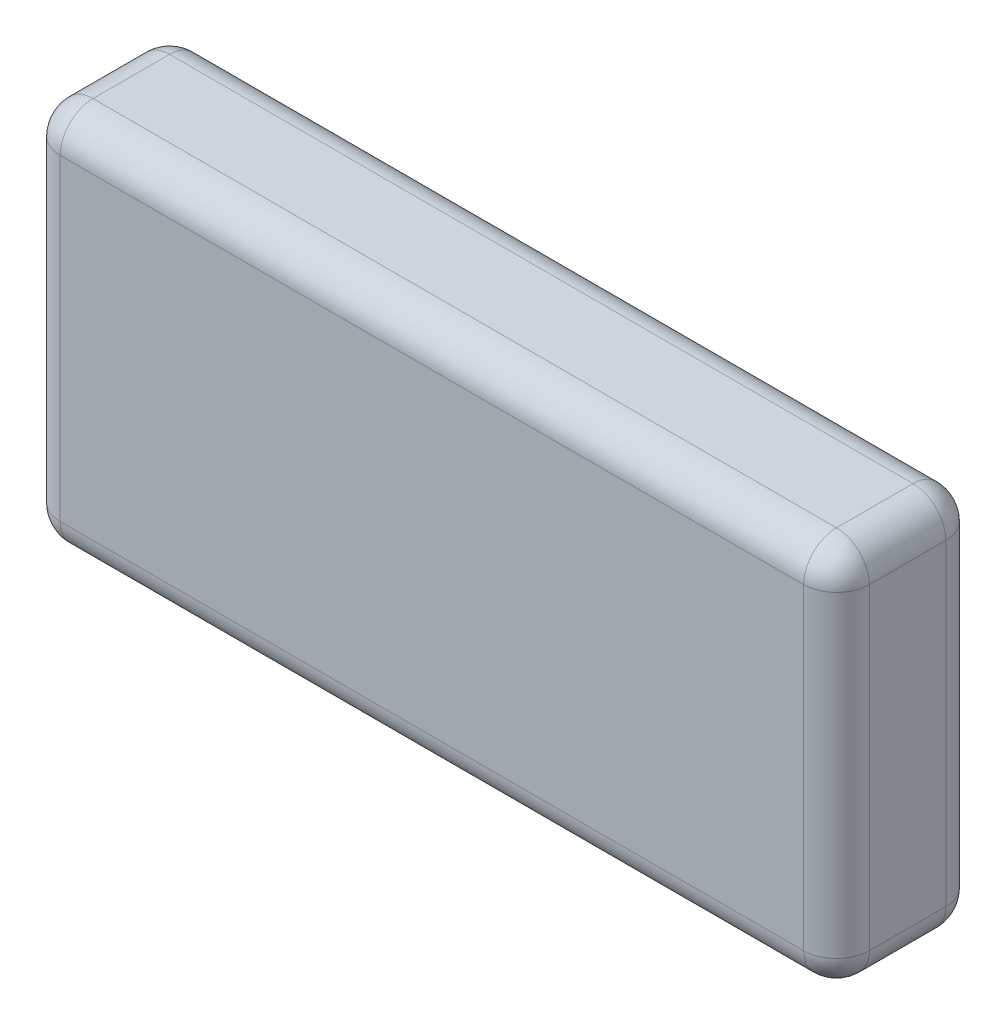
ISO-10303-21;
HEADER;
FILE_DESCRIPTION(('STEP AP214'),'2;1');
FILE_NAME('part.step','',(''),(''),'','','');
FILE_SCHEMA(('AUTOMOTIVE_DESIGN { 1 0 10303 214 1 1 1 1 }'));
ENDSEC;
DATA;
#1=APPLICATION_CONTEXT('core data for automotive mechanical design processes');
#2=APPLICATION_PROTOCOL_DEFINITION('international standard','automotive_design',2000,#1);
#3=PRODUCT_CONTEXT('',#1,'mechanical');
#4=PRODUCT('Part','Part','',(#3));
#5=PRODUCT_RELATED_PRODUCT_CATEGORY('part','',(#4));
#6=PRODUCT_DEFINITION_FORMATION('','',#4);
#7=PRODUCT_DEFINITION_CONTEXT('part definition',#1,'design');
#8=PRODUCT_DEFINITION('design','',#6,#7);
#9=PRODUCT_DEFINITION_SHAPE('','',#8);
#10=(LENGTH_UNIT() NAMED_UNIT(*) SI_UNIT(.MILLI.,.METRE.));
#11=(NAMED_UNIT(*) PLANE_ANGLE_UNIT() SI_UNIT($,.RADIAN.));
#12=(NAMED_UNIT(*) SI_UNIT($,.STERADIAN.) SOLID_ANGLE_UNIT());
#13=UNCERTAINTY_MEASURE_WITH_UNIT(LENGTH_MEASURE(1.E-05),#10,'distance_accuracy_value','');
#14=(GEOMETRIC_REPRESENTATION_CONTEXT(3) GLOBAL_UNCERTAINTY_ASSIGNED_CONTEXT((#13)) GLOBAL_UNIT_ASSIGNED_CONTEXT((#10,
#11,#12)) REPRESENTATION_CONTEXT('',''));
#15=CARTESIAN_POINT('',(0.,0.,0.));
#16=DIRECTION('',(0.,0.,1.));
#17=DIRECTION('',(1.,0.,0.));
#18=AXIS2_PLACEMENT_3D('',#15,#16,#17);
#19=CARTESIAN_POINT('',(-27.1121918241811,25.9843027227722,13.));
#20=DIRECTION('',(1.,0.,0.));
#21=DIRECTION('',(0.,1.,0.));
#22=AXIS2_PLACEMENT_3D('',#19,#20,#21);
#23=PLANE('',#22);
#24=DIRECTION('',(0.,-1.,0.));
#25=VECTOR('',#24,1.);
#26=CARTESIAN_POINT('',(-27.1121918241811,25.9843027227722,10.));
#27=LINE('',#26,#25);
#28=CARTESIAN_POINT('',(-27.1121918241811,-6.01569727722784,10.));
#29=VERTEX_POINT('',#28);
#30=CARTESIAN_POINT('',(-27.1121918241811,22.9843027227722,10.));
#31=VERTEX_POINT('',#30);
#32=EDGE_CURVE('E133',#29,#31,#27,.F.);
#33=ORIENTED_EDGE('',*,*,#32,.T.);
#34=DIRECTION('',(0.,0.,-1.));
#35=VECTOR('',#34,1.);
#36=CARTESIAN_POINT('',(-27.1121918241811,22.9843027227722,13.));
#37=LINE('',#36,#35);
#38=CARTESIAN_POINT('',(-27.1121918241811,22.9843027227722,3.));
#39=VERTEX_POINT('',#38);
#40=EDGE_CURVE('E129',#31,#39,#37,.T.);
#41=ORIENTED_EDGE('',*,*,#40,.T.);
#42=DIRECTION('',(0.,-1.,0.));
#43=VECTOR('',#42,1.);
#44=CARTESIAN_POINT('',(-27.1121918241811,25.9843027227722,3.));
#45=LINE('',#44,#43);
#46=CARTESIAN_POINT('',(-27.1121918241811,-6.01569727722784,3.));
#47=VERTEX_POINT('',#46);
#48=EDGE_CURVE('E124',#39,#47,#45,.T.);
#49=ORIENTED_EDGE('',*,*,#48,.T.);
#50=DIRECTION('',(0.,0.,-1.));
#51=VECTOR('',#50,1.);
#52=CARTESIAN_POINT('',(-27.1121918241811,-6.01569727722783,13.));
#53=LINE('',#52,#51);
#54=EDGE_CURVE('E126',#47,#29,#53,.F.);
#55=ORIENTED_EDGE('',*,*,#54,.T.);
#56=EDGE_LOOP('',(#33,#41,#49,#55));
#57=FACE_BOUND('',#56,.T.);
#58=ADVANCED_FACE('F33',(#57),#23,.F.);
#59=CARTESIAN_POINT('',(-27.1121918241811,-9.01569727722784,13.));
#60=DIRECTION('',(0.,1.,0.));
#61=DIRECTION('',(0.,0.,1.));
#62=AXIS2_PLACEMENT_3D('',#59,#60,#61);
#63=PLANE('',#62);
#64=DIRECTION('',(1.,0.,0.));
#65=VECTOR('',#64,1.);
#66=CARTESIAN_POINT('',(-27.1121918241811,-9.01569727722784,3.));
#67=LINE('',#66,#65);
#68=CARTESIAN_POINT('',(-24.1121918241811,-9.01569727722784,3.));
#69=VERTEX_POINT('',#68);
#70=CARTESIAN_POINT('',(43.8878081758189,-9.01569727722784,3.));
#71=VERTEX_POINT('',#70);
#72=EDGE_CURVE('E42',#69,#71,#67,.T.);
#73=ORIENTED_EDGE('',*,*,#72,.T.);
#74=DIRECTION('',(0.,0.,-1.));
#75=VECTOR('',#74,1.);
#76=CARTESIAN_POINT('',(43.8878081758189,-9.01569727722784,13.));
#77=LINE('',#76,#75);
#78=CARTESIAN_POINT('',(43.8878081758189,-9.01569727722784,10.));
#79=VERTEX_POINT('',#78);
#80=EDGE_CURVE('E11',#71,#79,#77,.F.);
#81=ORIENTED_EDGE('',*,*,#80,.T.);
#82=DIRECTION('',(1.,0.,0.));
#83=VECTOR('',#82,1.);
#84=CARTESIAN_POINT('',(-27.1121918241811,-9.01569727722784,10.));
#85=LINE('',#84,#83);
#86=CARTESIAN_POINT('',(-24.1121918241811,-9.01569727722784,10.));
#87=VERTEX_POINT('',#86);
#88=EDGE_CURVE('E56',#79,#87,#85,.F.);
#89=ORIENTED_EDGE('',*,*,#88,.T.);
#90=DIRECTION('',(0.,0.,-1.));
#91=VECTOR('',#90,1.);
#92=CARTESIAN_POINT('',(-24.1121918241811,-9.01569727722784,13.));
#93=LINE('',#92,#91);
#94=EDGE_CURVE('E233',#87,#69,#93,.T.);
#95=ORIENTED_EDGE('',*,*,#94,.T.);
#96=EDGE_LOOP('',(#73,#81,#89,#95));
#97=FACE_BOUND('',#96,.T.);
#98=ADVANCED_FACE('F297',(#97),#63,.F.);
#99=CARTESIAN_POINT('',(46.8878081758189,25.9843027227722,13.));
#100=DIRECTION('',(-1.,0.,0.));
#101=DIRECTION('',(0.,-1.,0.));
#102=AXIS2_PLACEMENT_3D('',#99,#100,#101);
#103=PLANE('',#102);
#104=DIRECTION('',(0.,1.,0.));
#105=VECTOR('',#104,1.);
#106=CARTESIAN_POINT('',(46.8878081758189,25.9843027227722,3.));
#107=LINE('',#106,#105);
#108=CARTESIAN_POINT('',(46.8878081758189,-6.01569727722783,3.));
#109=VERTEX_POINT('',#108);
#110=CARTESIAN_POINT('',(46.8878081758189,22.9843027227722,3.));
#111=VERTEX_POINT('',#110);
#112=EDGE_CURVE('E229',#109,#111,#107,.T.);
#113=ORIENTED_EDGE('',*,*,#112,.T.);
#114=DIRECTION('',(0.,0.,-1.));
#115=VECTOR('',#114,1.);
#116=CARTESIAN_POINT('',(46.8878081758189,22.9843027227722,13.));
#117=LINE('',#116,#115);
#118=CARTESIAN_POINT('',(46.8878081758189,22.9843027227722,10.));
#119=VERTEX_POINT('',#118);
#120=EDGE_CURVE('E231',#111,#119,#117,.F.);
#121=ORIENTED_EDGE('',*,*,#120,.T.);
#122=DIRECTION('',(0.,1.,0.));
#123=VECTOR('',#122,1.);
#124=CARTESIAN_POINT('',(46.8878081758189,-9.01569727722784,10.));
#125=LINE('',#124,#123);
#126=CARTESIAN_POINT('',(46.8878081758189,-6.01569727722783,10.));
#127=VERTEX_POINT('',#126);
#128=EDGE_CURVE('E212',#119,#127,#125,.F.);
#129=ORIENTED_EDGE('',*,*,#128,.T.);
#130=DIRECTION('',(0.,0.,-1.));
#131=VECTOR('',#130,1.);
#132=CARTESIAN_POINT('',(46.8878081758189,-6.01569727722783,13.));
#133=LINE('',#132,#131);
#134=EDGE_CURVE('E221',#127,#109,#133,.T.);
#135=ORIENTED_EDGE('',*,*,#134,.T.);
#136=EDGE_LOOP('',(#113,#121,#129,#135));
#137=FACE_BOUND('',#136,.T.);
#138=ADVANCED_FACE('F302',(#137),#103,.F.);
#139=CARTESIAN_POINT('',(-27.1121918241811,25.9843027227722,13.));
#140=DIRECTION('',(0.,-1.,0.));
#141=DIRECTION('',(0.,0.,-1.));
#142=AXIS2_PLACEMENT_3D('',#139,#140,#141);
#143=PLANE('',#142);
#144=DIRECTION('',(-1.,0.,0.));
#145=VECTOR('',#144,1.);
#146=CARTESIAN_POINT('',(-27.1121918241811,25.9843027227722,3.));
#147=LINE('',#146,#145);
#148=CARTESIAN_POINT('',(43.8878081758189,25.9843027227722,3.));
#149=VERTEX_POINT('',#148);
#150=CARTESIAN_POINT('',(-24.1121918241811,25.9843027227722,3.));
#151=VERTEX_POINT('',#150);
#152=EDGE_CURVE('E263',#149,#151,#147,.T.);
#153=ORIENTED_EDGE('',*,*,#152,.T.);
#154=DIRECTION('',(0.,0.,-1.));
#155=VECTOR('',#154,1.);
#156=CARTESIAN_POINT('',(-24.1121918241811,25.9843027227722,13.));
#157=LINE('',#156,#155);
#158=CARTESIAN_POINT('',(-24.1121918241811,25.9843027227722,10.));
#159=VERTEX_POINT('',#158);
#160=EDGE_CURVE('E267',#151,#159,#157,.F.);
#161=ORIENTED_EDGE('',*,*,#160,.T.);
#162=DIRECTION('',(-1.,0.,0.));
#163=VECTOR('',#162,1.);
#164=CARTESIAN_POINT('',(46.8878081758189,25.9843027227722,10.));
#165=LINE('',#164,#163);
#166=CARTESIAN_POINT('',(43.8878081758189,25.9843027227722,10.));
#167=VERTEX_POINT('',#166);
#168=EDGE_CURVE('E258',#159,#167,#165,.F.);
#169=ORIENTED_EDGE('',*,*,#168,.T.);
#170=DIRECTION('',(0.,0.,-1.));
#171=VECTOR('',#170,1.);
#172=CARTESIAN_POINT('',(43.8878081758189,25.9843027227722,13.));
#173=LINE('',#172,#171);
#174=EDGE_CURVE('E264',#167,#149,#173,.T.);
#175=ORIENTED_EDGE('',*,*,#174,.T.);
#176=EDGE_LOOP('',(#153,#161,#169,#175));
#177=FACE_BOUND('',#176,.T.);
#178=ADVANCED_FACE('F268',(#177),#143,.F.);
#179=CARTESIAN_POINT('',(0.,0.,13.));
#180=DIRECTION('',(0.,0.,1.));
#181=DIRECTION('',(1.,0.,0.));
#182=AXIS2_PLACEMENT_3D('',#179,#180,#181);
#183=PLANE('',#182);
#184=DIRECTION('',(0.,1.,0.));
#185=VECTOR('',#184,1.);
#186=CARTESIAN_POINT('',(43.8878081758189,25.9843027227722,13.));
#187=LINE('',#186,#185);
#188=CARTESIAN_POINT('',(43.8878081758189,-6.01569727722784,13.));
#189=VERTEX_POINT('',#188);
#190=CARTESIAN_POINT('',(43.8878081758189,22.9843027227722,13.));
#191=VERTEX_POINT('',#190);
#192=EDGE_CURVE('E214',#189,#191,#187,.T.);
#193=ORIENTED_EDGE('',*,*,#192,.T.);
#194=DIRECTION('',(-1.,0.,0.));
#195=VECTOR('',#194,1.);
#196=CARTESIAN_POINT('',(-27.1121918241811,22.9843027227722,13.));
#197=LINE('',#196,#195);
#198=CARTESIAN_POINT('',(-24.1121918241811,22.9843027227722,13.));
#199=VERTEX_POINT('',#198);
#200=EDGE_CURVE('E218',#191,#199,#197,.T.);
#201=ORIENTED_EDGE('',*,*,#200,.T.);
#202=DIRECTION('',(0.,-1.,0.));
#203=VECTOR('',#202,1.);
#204=CARTESIAN_POINT('',(-24.1121918241811,-9.01569727722784,13.));
#205=LINE('',#204,#203);
#206=CARTESIAN_POINT('',(-24.1121918241811,-6.01569727722784,13.));
#207=VERTEX_POINT('',#206);
#208=EDGE_CURVE('E219',#199,#207,#205,.T.);
#209=ORIENTED_EDGE('',*,*,#208,.T.);
#210=DIRECTION('',(1.,0.,0.));
#211=VECTOR('',#210,1.);
#212=CARTESIAN_POINT('',(46.8878081758189,-6.01569727722784,13.));
#213=LINE('',#212,#211);
#214=EDGE_CURVE('E223',#207,#189,#213,.T.);
#215=ORIENTED_EDGE('',*,*,#214,.T.);
#216=EDGE_LOOP('',(#193,#201,#209,#215));
#217=FACE_BOUND('',#216,.T.);
#218=ADVANCED_FACE('F284',(#217),#183,.T.);
#219=CARTESIAN_POINT('',(0.,0.,0.));
#220=DIRECTION('',(0.,0.,1.));
#221=DIRECTION('',(1.,0.,0.));
#222=AXIS2_PLACEMENT_3D('',#219,#220,#221);
#223=PLANE('',#222);
#224=DIRECTION('',(0.,-1.,0.));
#225=VECTOR('',#224,1.);
#226=CARTESIAN_POINT('',(-24.1121918241811,0.,0.));
#227=LINE('',#226,#225);
#228=CARTESIAN_POINT('',(-24.1121918241811,-6.01569727722784,0.));
#229=VERTEX_POINT('',#228);
#230=CARTESIAN_POINT('',(-24.1121918241811,22.9843027227722,0.));
#231=VERTEX_POINT('',#230);
#232=EDGE_CURVE('E155',#229,#231,#227,.F.);
#233=ORIENTED_EDGE('',*,*,#232,.T.);
#234=DIRECTION('',(-1.,0.,0.));
#235=VECTOR('',#234,1.);
#236=CARTESIAN_POINT('',(0.,22.9843027227722,0.));
#237=LINE('',#236,#235);
#238=CARTESIAN_POINT('',(43.8878081758189,22.9843027227722,0.));
#239=VERTEX_POINT('',#238);
#240=EDGE_CURVE('E281',#231,#239,#237,.F.);
#241=ORIENTED_EDGE('',*,*,#240,.T.);
#242=DIRECTION('',(0.,1.,0.));
#243=VECTOR('',#242,1.);
#244=CARTESIAN_POINT('',(43.8878081758189,0.,0.));
#245=LINE('',#244,#243);
#246=CARTESIAN_POINT('',(43.8878081758189,-6.01569727722784,0.));
#247=VERTEX_POINT('',#246);
#248=EDGE_CURVE('E279',#239,#247,#245,.F.);
#249=ORIENTED_EDGE('',*,*,#248,.T.);
#250=DIRECTION('',(1.,0.,0.));
#251=VECTOR('',#250,1.);
#252=CARTESIAN_POINT('',(0.,-6.01569727722784,0.));
#253=LINE('',#252,#251);
#254=EDGE_CURVE('E273',#247,#229,#253,.F.);
#255=ORIENTED_EDGE('',*,*,#254,.T.);
#256=EDGE_LOOP('',(#233,#241,#249,#255));
#257=FACE_BOUND('',#256,.T.);
#258=ADVANCED_FACE('F368',(#257),#223,.F.);
#259=CARTESIAN_POINT('',(43.8878081758189,-6.01569727722783,13.));
#260=DIRECTION('',(0.,0.,-1.));
#261=DIRECTION('',(-1.,0.,0.));
#262=AXIS2_PLACEMENT_3D('',#259,#260,#261);
#263=CYLINDRICAL_SURFACE('',#262,3.);
#264=CARTESIAN_POINT('',(43.8878081758189,-6.01569727722784,10.));
#265=DIRECTION('',(0.,0.,1.));
#266=DIRECTION('',(1.,0.,0.));
#267=AXIS2_PLACEMENT_3D('',#264,#265,#266);
#268=CIRCLE('',#267,3.);
#269=EDGE_CURVE('E37',#79,#127,#268,.T.);
#270=ORIENTED_EDGE('',*,*,#269,.F.);
#271=ORIENTED_EDGE('',*,*,#80,.F.);
#272=CARTESIAN_POINT('',(43.8878081758189,-6.01569727722783,3.));
#273=DIRECTION('',(0.,0.,-1.));
#274=DIRECTION('',(-1.,0.,0.));
#275=AXIS2_PLACEMENT_3D('',#272,#273,#274);
#276=CIRCLE('',#275,3.);
#277=EDGE_CURVE('E194',#109,#71,#276,.T.);
#278=ORIENTED_EDGE('',*,*,#277,.F.);
#279=ORIENTED_EDGE('',*,*,#134,.F.);
#280=EDGE_LOOP('',(#270,#271,#278,#279));
#281=FACE_BOUND('',#280,.T.);
#282=ADVANCED_FACE('F35',(#281),#263,.T.);
#283=CARTESIAN_POINT('',(43.8878081758189,-6.01569727722784,10.));
#284=DIRECTION('',(0.,0.,1.));
#285=DIRECTION('',(1.,0.,0.));
#286=AXIS2_PLACEMENT_3D('',#283,#284,#285);
#287=SPHERICAL_SURFACE('',#286,3.);
#288=CARTESIAN_POINT('',(43.8878081758189,-6.01569727722784,10.));
#289=DIRECTION('',(1.,0.,0.));
#290=DIRECTION('',(0.,0.,-1.));
#291=AXIS2_PLACEMENT_3D('',#288,#289,#290);
#292=CIRCLE('',#291,3.);
#293=EDGE_CURVE('E190',#79,#189,#292,.F.);
#294=ORIENTED_EDGE('',*,*,#293,.F.);
#295=ORIENTED_EDGE('',*,*,#269,.T.);
#296=CARTESIAN_POINT('',(43.8878081758189,-6.01569727722783,10.));
#297=DIRECTION('',(0.,-1.,0.));
#298=DIRECTION('',(0.,0.,-1.));
#299=AXIS2_PLACEMENT_3D('',#296,#297,#298);
#300=CIRCLE('',#299,3.);
#301=EDGE_CURVE('E192',#189,#127,#300,.F.);
#302=ORIENTED_EDGE('',*,*,#301,.F.);
#303=EDGE_LOOP('',(#294,#295,#302));
#304=FACE_BOUND('',#303,.T.);
#305=ADVANCED_FACE('F204',(#304),#287,.T.);
#306=CARTESIAN_POINT('',(43.8878081758189,-6.01569727722784,3.));
#307=DIRECTION('',(0.,0.,1.));
#308=DIRECTION('',(1.,0.,0.));
#309=AXIS2_PLACEMENT_3D('',#306,#307,#308);
#310=SPHERICAL_SURFACE('',#309,3.);
#311=CARTESIAN_POINT('',(43.8878081758189,-6.01569727722784,3.));
#312=DIRECTION('',(0.,-1.,0.));
#313=DIRECTION('',(1.,0.,0.));
#314=AXIS2_PLACEMENT_3D('',#311,#312,#313);
#315=CIRCLE('',#314,3.);
#316=EDGE_CURVE('E184',#109,#247,#315,.F.);
#317=ORIENTED_EDGE('',*,*,#316,.F.);
#318=ORIENTED_EDGE('',*,*,#277,.T.);
#319=CARTESIAN_POINT('',(43.8878081758189,-6.01569727722784,3.));
#320=DIRECTION('',(1.,0.,0.));
#321=DIRECTION('',(0.,0.,-1.));
#322=AXIS2_PLACEMENT_3D('',#319,#320,#321);
#323=CIRCLE('',#322,3.);
#324=EDGE_CURVE('E187',#247,#71,#323,.F.);
#325=ORIENTED_EDGE('',*,*,#324,.F.);
#326=EDGE_LOOP('',(#317,#318,#325));
#327=FACE_BOUND('',#326,.T.);
#328=ADVANCED_FACE('F294',(#327),#310,.T.);
#329=CARTESIAN_POINT('',(43.8878081758189,0.,10.));
#330=DIRECTION('',(0.,-1.,0.));
#331=DIRECTION('',(1.,0.,0.));
#332=AXIS2_PLACEMENT_3D('',#329,#330,#331);
#333=CYLINDRICAL_SURFACE('',#332,3.);
#334=ORIENTED_EDGE('',*,*,#301,.T.);
#335=ORIENTED_EDGE('',*,*,#128,.F.);
#336=CARTESIAN_POINT('',(43.8878081758189,22.9843027227722,10.));
#337=DIRECTION('',(0.,1.,0.));
#338=DIRECTION('',(0.,0.,1.));
#339=AXIS2_PLACEMENT_3D('',#336,#337,#338);
#340=CIRCLE('',#339,3.);
#341=EDGE_CURVE('E179',#191,#119,#340,.T.);
#342=ORIENTED_EDGE('',*,*,#341,.F.);
#343=ORIENTED_EDGE('',*,*,#192,.F.);
#344=EDGE_LOOP('',(#334,#335,#342,#343));
#345=FACE_BOUND('',#344,.T.);
#346=ADVANCED_FACE('F210',(#345),#333,.T.);
#347=CARTESIAN_POINT('',(0.,-6.01569727722784,10.));
#348=DIRECTION('',(-1.,0.,0.));
#349=DIRECTION('',(0.,0.,1.));
#350=AXIS2_PLACEMENT_3D('',#347,#348,#349);
#351=CYLINDRICAL_SURFACE('',#350,3.);
#352=ORIENTED_EDGE('',*,*,#293,.T.);
#353=ORIENTED_EDGE('',*,*,#214,.F.);
#354=CARTESIAN_POINT('',(-24.1121918241811,-6.01569727722784,10.));
#355=DIRECTION('',(-1.,0.,0.));
#356=DIRECTION('',(0.,0.,1.));
#357=AXIS2_PLACEMENT_3D('',#354,#355,#356);
#358=CIRCLE('',#357,3.);
#359=EDGE_CURVE('E176',#87,#207,#358,.T.);
#360=ORIENTED_EDGE('',*,*,#359,.F.);
#361=ORIENTED_EDGE('',*,*,#88,.F.);
#362=EDGE_LOOP('',(#352,#353,#360,#361));
#363=FACE_BOUND('',#362,.T.);
#364=ADVANCED_FACE('F285',(#363),#351,.T.);
#365=CARTESIAN_POINT('',(-24.1121918241811,-6.01569727722784,13.));
#366=DIRECTION('',(0.,0.,-1.));
#367=DIRECTION('',(-1.,0.,0.));
#368=AXIS2_PLACEMENT_3D('',#365,#366,#367);
#369=CYLINDRICAL_SURFACE('',#368,3.);
#370=CARTESIAN_POINT('',(-24.1121918241811,-6.01569727722784,3.));
#371=DIRECTION('',(0.,0.,-1.));
#372=DIRECTION('',(-1.,0.,0.));
#373=AXIS2_PLACEMENT_3D('',#370,#371,#372);
#374=CIRCLE('',#373,3.);
#375=EDGE_CURVE('E140',#69,#47,#374,.T.);
#376=ORIENTED_EDGE('',*,*,#375,.F.);
#377=ORIENTED_EDGE('',*,*,#94,.F.);
#378=CARTESIAN_POINT('',(-24.1121918241811,-6.01569727722784,10.));
#379=DIRECTION('',(0.,0.,1.));
#380=DIRECTION('',(1.,0.,0.));
#381=AXIS2_PLACEMENT_3D('',#378,#379,#380);
#382=CIRCLE('',#381,3.);
#383=EDGE_CURVE('E143',#29,#87,#382,.T.);
#384=ORIENTED_EDGE('',*,*,#383,.F.);
#385=ORIENTED_EDGE('',*,*,#54,.F.);
#386=EDGE_LOOP('',(#376,#377,#384,#385));
#387=FACE_BOUND('',#386,.T.);
#388=ADVANCED_FACE('F138',(#387),#369,.T.);
#389=CARTESIAN_POINT('',(-27.1121918241811,-6.01569727722784,3.));
#390=DIRECTION('',(1.,0.,0.));
#391=DIRECTION('',(0.,0.,-1.));
#392=AXIS2_PLACEMENT_3D('',#389,#390,#391);
#393=CYLINDRICAL_SURFACE('',#392,3.);
#394=ORIENTED_EDGE('',*,*,#324,.T.);
#395=ORIENTED_EDGE('',*,*,#72,.F.);
#396=CARTESIAN_POINT('',(-24.1121918241811,-6.01569727722784,3.));
#397=DIRECTION('',(-1.,0.,0.));
#398=DIRECTION('',(0.,0.,1.));
#399=AXIS2_PLACEMENT_3D('',#396,#397,#398);
#400=CIRCLE('',#399,3.);
#401=EDGE_CURVE('E152',#229,#69,#400,.T.);
#402=ORIENTED_EDGE('',*,*,#401,.F.);
#403=ORIENTED_EDGE('',*,*,#254,.F.);
#404=EDGE_LOOP('',(#394,#395,#402,#403));
#405=FACE_BOUND('',#404,.T.);
#406=ADVANCED_FACE('F292',(#405),#393,.T.);
#407=CARTESIAN_POINT('',(43.8878081758189,25.9843027227722,3.));
#408=DIRECTION('',(0.,1.,0.));
#409=DIRECTION('',(-1.,0.,0.));
#410=AXIS2_PLACEMENT_3D('',#407,#408,#409);
#411=CYLINDRICAL_SURFACE('',#410,3.);
#412=ORIENTED_EDGE('',*,*,#316,.T.);
#413=ORIENTED_EDGE('',*,*,#248,.F.);
#414=CARTESIAN_POINT('',(43.8878081758189,22.9843027227722,3.));
#415=DIRECTION('',(0.,1.,0.));
#416=DIRECTION('',(0.,0.,1.));
#417=AXIS2_PLACEMENT_3D('',#414,#415,#416);
#418=CIRCLE('',#417,3.);
#419=EDGE_CURVE('E171',#111,#239,#418,.T.);
#420=ORIENTED_EDGE('',*,*,#419,.F.);
#421=ORIENTED_EDGE('',*,*,#112,.F.);
#422=EDGE_LOOP('',(#412,#413,#420,#421));
#423=FACE_BOUND('',#422,.T.);
#424=ADVANCED_FACE('F344',(#423),#411,.T.);
#425=CARTESIAN_POINT('',(43.8878081758189,22.9843027227722,13.));
#426=DIRECTION('',(0.,0.,-1.));
#427=DIRECTION('',(-1.,0.,0.));
#428=AXIS2_PLACEMENT_3D('',#425,#426,#427);
#429=CYLINDRICAL_SURFACE('',#428,3.);
#430=CARTESIAN_POINT('',(43.8878081758189,22.9843027227722,10.));
#431=DIRECTION('',(0.,0.,1.));
#432=DIRECTION('',(1.,0.,0.));
#433=AXIS2_PLACEMENT_3D('',#430,#431,#432);
#434=CIRCLE('',#433,3.);
#435=EDGE_CURVE('E181',#119,#167,#434,.T.);
#436=ORIENTED_EDGE('',*,*,#435,.F.);
#437=ORIENTED_EDGE('',*,*,#120,.F.);
#438=CARTESIAN_POINT('',(43.8878081758189,22.9843027227722,3.));
#439=DIRECTION('',(0.,0.,-1.));
#440=DIRECTION('',(-1.,0.,0.));
#441=AXIS2_PLACEMENT_3D('',#438,#439,#440);
#442=CIRCLE('',#441,3.);
#443=EDGE_CURVE('E168',#149,#111,#442,.T.);
#444=ORIENTED_EDGE('',*,*,#443,.F.);
#445=ORIENTED_EDGE('',*,*,#174,.F.);
#446=EDGE_LOOP('',(#436,#437,#444,#445));
#447=FACE_BOUND('',#446,.T.);
#448=ADVANCED_FACE('F340',(#447),#429,.T.);
#449=CARTESIAN_POINT('',(43.8878081758189,22.9843027227722,10.));
#450=DIRECTION('',(0.,0.,1.));
#451=DIRECTION('',(1.,0.,0.));
#452=AXIS2_PLACEMENT_3D('',#449,#450,#451);
#453=SPHERICAL_SURFACE('',#452,3.);
#454=ORIENTED_EDGE('',*,*,#341,.T.);
#455=ORIENTED_EDGE('',*,*,#435,.T.);
#456=CARTESIAN_POINT('',(43.8878081758189,22.9843027227722,10.));
#457=DIRECTION('',(1.,0.,0.));
#458=DIRECTION('',(0.,0.,-1.));
#459=AXIS2_PLACEMENT_3D('',#456,#457,#458);
#460=CIRCLE('',#459,3.);
#461=EDGE_CURVE('E160',#191,#167,#460,.F.);
#462=ORIENTED_EDGE('',*,*,#461,.F.);
#463=EDGE_LOOP('',(#454,#455,#462));
#464=FACE_BOUND('',#463,.T.);
#465=ADVANCED_FACE('F336',(#464),#453,.T.);
#466=CARTESIAN_POINT('',(-24.1121918241811,-6.01569727722784,10.));
#467=DIRECTION('',(0.,0.,1.));
#468=DIRECTION('',(1.,0.,0.));
#469=AXIS2_PLACEMENT_3D('',#466,#467,#468);
#470=SPHERICAL_SURFACE('',#469,3.);
#471=ORIENTED_EDGE('',*,*,#383,.T.);
#472=ORIENTED_EDGE('',*,*,#359,.T.);
#473=CARTESIAN_POINT('',(-24.1121918241811,-6.01569727722784,10.));
#474=DIRECTION('',(0.,-1.,0.));
#475=DIRECTION('',(0.,0.,-1.));
#476=AXIS2_PLACEMENT_3D('',#473,#474,#475);
#477=CIRCLE('',#476,3.);
#478=EDGE_CURVE('E156',#29,#207,#477,.F.);
#479=ORIENTED_EDGE('',*,*,#478,.F.);
#480=EDGE_LOOP('',(#471,#472,#479));
#481=FACE_BOUND('',#480,.T.);
#482=ADVANCED_FACE('F333',(#481),#470,.T.);
#483=CARTESIAN_POINT('',(-24.1121918241811,-6.01569727722784,3.));
#484=DIRECTION('',(0.,0.,1.));
#485=DIRECTION('',(1.,0.,0.));
#486=AXIS2_PLACEMENT_3D('',#483,#484,#485);
#487=SPHERICAL_SURFACE('',#486,3.);
#488=ORIENTED_EDGE('',*,*,#401,.T.);
#489=ORIENTED_EDGE('',*,*,#375,.T.);
#490=CARTESIAN_POINT('',(-24.1121918241811,-6.01569727722784,3.));
#491=DIRECTION('',(0.,-1.,0.));
#492=DIRECTION('',(0.,0.,-1.));
#493=AXIS2_PLACEMENT_3D('',#490,#491,#492);
#494=CIRCLE('',#493,3.);
#495=EDGE_CURVE('E149',#229,#47,#494,.F.);
#496=ORIENTED_EDGE('',*,*,#495,.F.);
#497=EDGE_LOOP('',(#488,#489,#496));
#498=FACE_BOUND('',#497,.T.);
#499=ADVANCED_FACE('F148',(#498),#487,.T.);
#500=CARTESIAN_POINT('',(43.8878081758189,22.9843027227722,3.));
#501=DIRECTION('',(0.,0.,1.));
#502=DIRECTION('',(1.,0.,0.));
#503=AXIS2_PLACEMENT_3D('',#500,#501,#502);
#504=SPHERICAL_SURFACE('',#503,3.);
#505=ORIENTED_EDGE('',*,*,#443,.T.);
#506=ORIENTED_EDGE('',*,*,#419,.T.);
#507=CARTESIAN_POINT('',(43.8878081758189,22.9843027227722,3.));
#508=DIRECTION('',(1.,0.,0.));
#509=DIRECTION('',(0.,1.,0.));
#510=AXIS2_PLACEMENT_3D('',#507,#508,#509);
#511=CIRCLE('',#510,3.);
#512=EDGE_CURVE('E157',#149,#239,#511,.F.);
#513=ORIENTED_EDGE('',*,*,#512,.F.);
#514=EDGE_LOOP('',(#505,#506,#513));
#515=FACE_BOUND('',#514,.T.);
#516=ADVANCED_FACE('F327',(#515),#504,.T.);
#517=CARTESIAN_POINT('',(0.,22.9843027227722,10.));
#518=DIRECTION('',(1.,0.,0.));
#519=DIRECTION('',(0.,0.,-1.));
#520=AXIS2_PLACEMENT_3D('',#517,#518,#519);
#521=CYLINDRICAL_SURFACE('',#520,3.);
#522=ORIENTED_EDGE('',*,*,#461,.T.);
#523=ORIENTED_EDGE('',*,*,#168,.F.);
#524=CARTESIAN_POINT('',(-24.1121918241811,22.9843027227722,10.));
#525=DIRECTION('',(-1.,0.,0.));
#526=DIRECTION('',(0.,0.,1.));
#527=AXIS2_PLACEMENT_3D('',#524,#525,#526);
#528=CIRCLE('',#527,3.);
#529=EDGE_CURVE('E162',#199,#159,#528,.T.);
#530=ORIENTED_EDGE('',*,*,#529,.F.);
#531=ORIENTED_EDGE('',*,*,#200,.F.);
#532=EDGE_LOOP('',(#522,#523,#530,#531));
#533=FACE_BOUND('',#532,.T.);
#534=ADVANCED_FACE('F260',(#533),#521,.T.);
#535=CARTESIAN_POINT('',(-24.1121918241811,0.,10.));
#536=DIRECTION('',(0.,1.,0.));
#537=DIRECTION('',(-1.,0.,0.));
#538=AXIS2_PLACEMENT_3D('',#535,#536,#537);
#539=CYLINDRICAL_SURFACE('',#538,3.);
#540=ORIENTED_EDGE('',*,*,#478,.T.);
#541=ORIENTED_EDGE('',*,*,#208,.F.);
#542=CARTESIAN_POINT('',(-24.1121918241811,22.9843027227722,10.));
#543=DIRECTION('',(0.,1.,0.));
#544=DIRECTION('',(0.,0.,1.));
#545=AXIS2_PLACEMENT_3D('',#542,#543,#544);
#546=CIRCLE('',#545,3.);
#547=EDGE_CURVE('E247',#31,#199,#546,.T.);
#548=ORIENTED_EDGE('',*,*,#547,.F.);
#549=ORIENTED_EDGE('',*,*,#32,.F.);
#550=EDGE_LOOP('',(#540,#541,#548,#549));
#551=FACE_BOUND('',#550,.T.);
#552=ADVANCED_FACE('F321',(#551),#539,.T.);
#553=CARTESIAN_POINT('',(-24.1121918241811,25.9843027227722,3.));
#554=DIRECTION('',(0.,-1.,0.));
#555=DIRECTION('',(1.,0.,0.));
#556=AXIS2_PLACEMENT_3D('',#553,#554,#555);
#557=CYLINDRICAL_SURFACE('',#556,3.);
#558=ORIENTED_EDGE('',*,*,#495,.T.);
#559=ORIENTED_EDGE('',*,*,#48,.F.);
#560=CARTESIAN_POINT('',(-24.1121918241811,22.9843027227722,3.));
#561=DIRECTION('',(0.,1.,0.));
#562=DIRECTION('',(0.,0.,1.));
#563=AXIS2_PLACEMENT_3D('',#560,#561,#562);
#564=CIRCLE('',#563,3.);
#565=EDGE_CURVE('E244',#231,#39,#564,.T.);
#566=ORIENTED_EDGE('',*,*,#565,.F.);
#567=ORIENTED_EDGE('',*,*,#232,.F.);
#568=EDGE_LOOP('',(#558,#559,#566,#567));
#569=FACE_BOUND('',#568,.T.);
#570=ADVANCED_FACE('F154',(#569),#557,.T.);
#571=CARTESIAN_POINT('',(-27.1121918241811,22.9843027227722,3.));
#572=DIRECTION('',(-1.,0.,0.));
#573=DIRECTION('',(0.,0.,1.));
#574=AXIS2_PLACEMENT_3D('',#571,#572,#573);
#575=CYLINDRICAL_SURFACE('',#574,3.);
#576=ORIENTED_EDGE('',*,*,#512,.T.);
#577=ORIENTED_EDGE('',*,*,#240,.F.);
#578=CARTESIAN_POINT('',(-24.1121918241811,22.9843027227722,3.));
#579=DIRECTION('',(-1.,0.,0.));
#580=DIRECTION('',(0.,0.,1.));
#581=AXIS2_PLACEMENT_3D('',#578,#579,#580);
#582=CIRCLE('',#581,3.);
#583=EDGE_CURVE('E241',#151,#231,#582,.T.);
#584=ORIENTED_EDGE('',*,*,#583,.F.);
#585=ORIENTED_EDGE('',*,*,#152,.F.);
#586=EDGE_LOOP('',(#576,#577,#584,#585));
#587=FACE_BOUND('',#586,.T.);
#588=ADVANCED_FACE('F315',(#587),#575,.T.);
#589=CARTESIAN_POINT('',(-24.1121918241811,22.9843027227722,10.));
#590=DIRECTION('',(0.,0.,1.));
#591=DIRECTION('',(1.,0.,0.));
#592=AXIS2_PLACEMENT_3D('',#589,#590,#591);
#593=SPHERICAL_SURFACE('',#592,3.);
#594=ORIENTED_EDGE('',*,*,#547,.T.);
#595=ORIENTED_EDGE('',*,*,#529,.T.);
#596=CARTESIAN_POINT('',(-24.1121918241811,22.9843027227722,10.));
#597=DIRECTION('',(0.,0.,1.));
#598=DIRECTION('',(1.,0.,0.));
#599=AXIS2_PLACEMENT_3D('',#596,#597,#598);
#600=CIRCLE('',#599,3.);
#601=EDGE_CURVE('E239',#31,#159,#600,.F.);
#602=ORIENTED_EDGE('',*,*,#601,.F.);
#603=EDGE_LOOP('',(#594,#595,#602));
#604=FACE_BOUND('',#603,.T.);
#605=ADVANCED_FACE('F253',(#604),#593,.T.);
#606=CARTESIAN_POINT('',(-24.1121918241811,22.9843027227722,3.));
#607=DIRECTION('',(0.,0.,1.));
#608=DIRECTION('',(1.,0.,0.));
#609=AXIS2_PLACEMENT_3D('',#606,#607,#608);
#610=SPHERICAL_SURFACE('',#609,3.);
#611=ORIENTED_EDGE('',*,*,#583,.T.);
#612=ORIENTED_EDGE('',*,*,#565,.T.);
#613=CARTESIAN_POINT('',(-24.1121918241811,22.9843027227722,3.));
#614=DIRECTION('',(0.,0.,-1.));
#615=DIRECTION('',(-1.,0.,0.));
#616=AXIS2_PLACEMENT_3D('',#613,#614,#615);
#617=CIRCLE('',#616,3.);
#618=EDGE_CURVE('E237',#151,#39,#617,.F.);
#619=ORIENTED_EDGE('',*,*,#618,.F.);
#620=EDGE_LOOP('',(#611,#612,#619));
#621=FACE_BOUND('',#620,.T.);
#622=ADVANCED_FACE('F309',(#621),#610,.T.);
#623=CARTESIAN_POINT('',(-24.1121918241811,22.9843027227722,13.));
#624=DIRECTION('',(0.,0.,-1.));
#625=DIRECTION('',(-1.,0.,0.));
#626=AXIS2_PLACEMENT_3D('',#623,#624,#625);
#627=CYLINDRICAL_SURFACE('',#626,3.);
#628=ORIENTED_EDGE('',*,*,#601,.T.);
#629=ORIENTED_EDGE('',*,*,#160,.F.);
#630=ORIENTED_EDGE('',*,*,#618,.T.);
#631=ORIENTED_EDGE('',*,*,#40,.F.);
#632=EDGE_LOOP('',(#628,#629,#630,#631));
#633=FACE_BOUND('',#632,.T.);
#634=ADVANCED_FACE('F306',(#633),#627,.T.);
#635=CLOSED_SHELL('',(#58,#98,#138,#178,#218,#258,#282,#305,#328,#346,#364,#388,#406,#424,#448,
#465,#482,#499,#516,#534,#552,#570,#588,#605,#622,#634));
#636=MANIFOLD_SOLID_BREP('B2',#635);
#637=ADVANCED_BREP_SHAPE_REPRESENTATION('',(#18,#636),#14);
#638=SHAPE_DEFINITION_REPRESENTATION(#9,#637);
ENDSEC;
END-ISO-10303-21;
